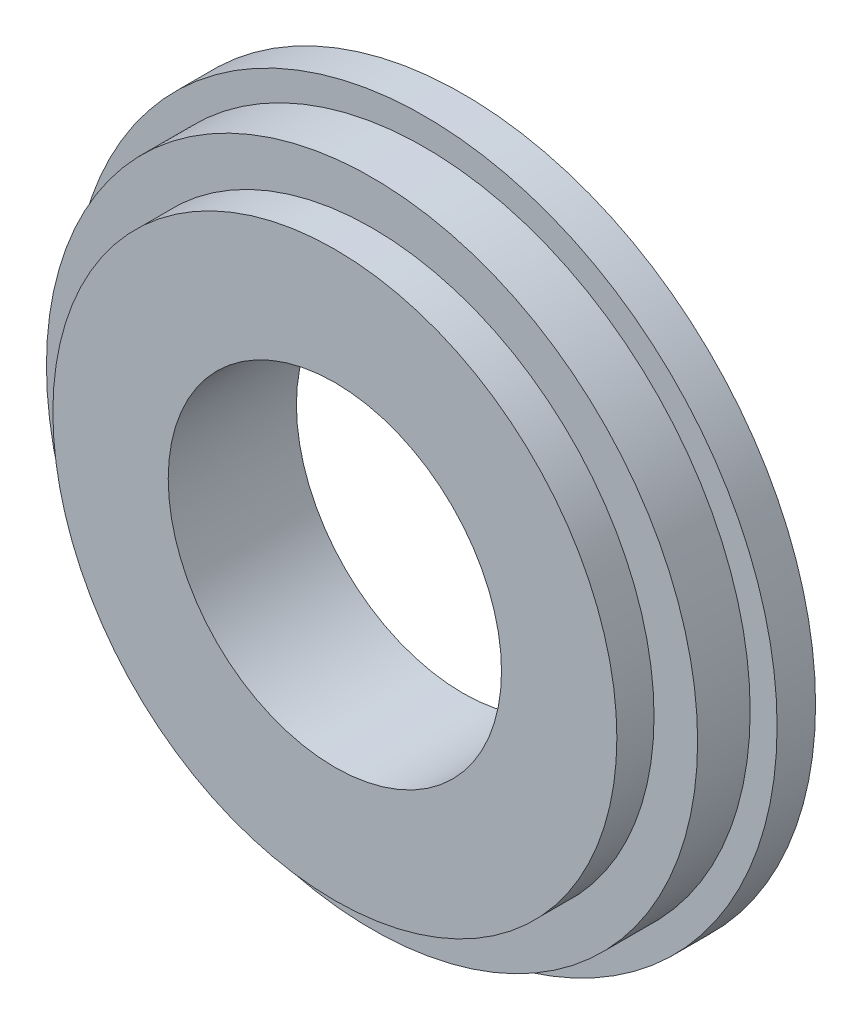
ISO-10303-21;
HEADER;
FILE_DESCRIPTION(('STEP AP214'),'2;1');
FILE_NAME('part.step','',(''),(''),'','','');
FILE_SCHEMA(('AUTOMOTIVE_DESIGN { 1 0 10303 214 1 1 1 1 }'));
ENDSEC;
DATA;
#1=APPLICATION_CONTEXT('core data for automotive mechanical design processes');
#2=APPLICATION_PROTOCOL_DEFINITION('international standard','automotive_design',2000,#1);
#3=PRODUCT_CONTEXT('',#1,'mechanical');
#4=PRODUCT('Part','Part','',(#3));
#5=PRODUCT_RELATED_PRODUCT_CATEGORY('part','',(#4));
#6=PRODUCT_DEFINITION_FORMATION('','',#4);
#7=PRODUCT_DEFINITION_CONTEXT('part definition',#1,'design');
#8=PRODUCT_DEFINITION('design','',#6,#7);
#9=PRODUCT_DEFINITION_SHAPE('','',#8);
#10=(LENGTH_UNIT() NAMED_UNIT(*) SI_UNIT(.MILLI.,.METRE.));
#11=(NAMED_UNIT(*) PLANE_ANGLE_UNIT() SI_UNIT($,.RADIAN.));
#12=(NAMED_UNIT(*) SI_UNIT($,.STERADIAN.) SOLID_ANGLE_UNIT());
#13=UNCERTAINTY_MEASURE_WITH_UNIT(LENGTH_MEASURE(1.E-05),#10,'distance_accuracy_value','');
#14=(GEOMETRIC_REPRESENTATION_CONTEXT(3) GLOBAL_UNCERTAINTY_ASSIGNED_CONTEXT((#13)) GLOBAL_UNIT_ASSIGNED_CONTEXT((#10,
#11,#12)) REPRESENTATION_CONTEXT('',''));
#15=CARTESIAN_POINT('',(0.,0.,0.));
#16=DIRECTION('',(0.,0.,1.));
#17=DIRECTION('',(1.,0.,0.));
#18=AXIS2_PLACEMENT_3D('',#15,#16,#17);
#19=CARTESIAN_POINT('',(0.,0.,3.));
#20=DIRECTION('',(0.,0.,-1.));
#21=DIRECTION('',(-1.,0.,0.));
#22=AXIS2_PLACEMENT_3D('',#19,#20,#21);
#23=CYLINDRICAL_SURFACE('',#22,27.5);
#24=CARTESIAN_POINT('',(0.,0.,3.));
#25=DIRECTION('',(0.,0.,1.));
#26=DIRECTION('',(1.,0.,0.));
#27=AXIS2_PLACEMENT_3D('',#24,#25,#26);
#28=CIRCLE('',#27,27.5);
#29=CARTESIAN_POINT('',(27.5,0.,3.));
#30=VERTEX_POINT('',#29);
#31=EDGE_CURVE('E10',#30,#30,#28,.T.);
#32=ORIENTED_EDGE('',*,*,#31,.F.);
#33=EDGE_LOOP('',(#32));
#34=FACE_BOUND('',#33,.T.);
#35=CARTESIAN_POINT('',(0.,0.,0.));
#36=DIRECTION('',(0.,0.,1.));
#37=DIRECTION('',(1.,0.,0.));
#38=AXIS2_PLACEMENT_3D('',#35,#36,#37);
#39=CIRCLE('',#38,27.5);
#40=CARTESIAN_POINT('',(27.5,0.,0.));
#41=VERTEX_POINT('',#40);
#42=EDGE_CURVE('E40',#41,#41,#39,.T.);
#43=ORIENTED_EDGE('',*,*,#42,.T.);
#44=EDGE_LOOP('',(#43));
#45=FACE_BOUND('',#44,.T.);
#46=ADVANCED_FACE('F33',(#34,#45),#23,.T.);
#47=CARTESIAN_POINT('',(0.,0.,3.));
#48=DIRECTION('',(0.,0.,1.));
#49=DIRECTION('',(1.,0.,0.));
#50=AXIS2_PLACEMENT_3D('',#47,#48,#49);
#51=PLANE('',#50);
#52=CARTESIAN_POINT('',(0.,0.,3.));
#53=DIRECTION('',(0.,0.,1.));
#54=DIRECTION('',(1.,0.,0.));
#55=AXIS2_PLACEMENT_3D('',#52,#53,#54);
#56=CIRCLE('',#55,25.4);
#57=CARTESIAN_POINT('',(25.4,0.,3.));
#58=VERTEX_POINT('',#57);
#59=EDGE_CURVE('E45',#58,#58,#56,.F.);
#60=ORIENTED_EDGE('',*,*,#59,.T.);
#61=EDGE_LOOP('',(#60));
#62=FACE_BOUND('',#61,.T.);
#63=ORIENTED_EDGE('',*,*,#31,.T.);
#64=EDGE_LOOP('',(#63));
#65=FACE_BOUND('',#64,.T.);
#66=ADVANCED_FACE('F84',(#62,#65),#51,.T.);
#67=CARTESIAN_POINT('',(0.,0.,0.));
#68=DIRECTION('',(0.,0.,1.));
#69=DIRECTION('',(1.,0.,0.));
#70=AXIS2_PLACEMENT_3D('',#67,#68,#69);
#71=PLANE('',#70);
#72=CARTESIAN_POINT('',(0.,0.,0.));
#73=DIRECTION('',(0.,0.,1.));
#74=DIRECTION('',(1.,0.,0.));
#75=AXIS2_PLACEMENT_3D('',#72,#73,#74);
#76=CIRCLE('',#75,13.);
#77=CARTESIAN_POINT('',(13.,0.,0.));
#78=VERTEX_POINT('',#77);
#79=EDGE_CURVE('E56',#78,#78,#76,.T.);
#80=ORIENTED_EDGE('',*,*,#79,.T.);
#81=EDGE_LOOP('',(#80));
#82=FACE_BOUND('',#81,.T.);
#83=ORIENTED_EDGE('',*,*,#42,.F.);
#84=EDGE_LOOP('',(#83));
#85=FACE_BOUND('',#84,.T.);
#86=ADVANCED_FACE('F89',(#82,#85),#71,.F.);
#87=CARTESIAN_POINT('',(0.,0.,7.1));
#88=DIRECTION('',(0.,0.,-1.));
#89=DIRECTION('',(-1.,0.,0.));
#90=AXIS2_PLACEMENT_3D('',#87,#88,#89);
#91=CYLINDRICAL_SURFACE('',#90,25.4);
#92=ORIENTED_EDGE('',*,*,#59,.F.);
#93=EDGE_LOOP('',(#92));
#94=FACE_BOUND('',#93,.T.);
#95=CARTESIAN_POINT('',(0.,0.,7.1));
#96=DIRECTION('',(0.,0.,1.));
#97=DIRECTION('',(1.,0.,0.));
#98=AXIS2_PLACEMENT_3D('',#95,#96,#97);
#99=CIRCLE('',#98,25.4);
#100=CARTESIAN_POINT('',(25.4,0.,7.1));
#101=VERTEX_POINT('',#100);
#102=EDGE_CURVE('E49',#101,#101,#99,.T.);
#103=ORIENTED_EDGE('',*,*,#102,.F.);
#104=EDGE_LOOP('',(#103));
#105=FACE_BOUND('',#104,.T.);
#106=ADVANCED_FACE('F79',(#94,#105),#91,.T.);
#107=CARTESIAN_POINT('',(0.,0.,7.1));
#108=DIRECTION('',(0.,0.,1.));
#109=DIRECTION('',(1.,0.,0.));
#110=AXIS2_PLACEMENT_3D('',#107,#108,#109);
#111=PLANE('',#110);
#112=CARTESIAN_POINT('',(0.,0.,7.1));
#113=DIRECTION('',(0.,0.,1.));
#114=DIRECTION('',(1.,0.,0.));
#115=AXIS2_PLACEMENT_3D('',#112,#113,#114);
#116=CIRCLE('',#115,22.);
#117=CARTESIAN_POINT('',(22.,0.,7.1));
#118=VERTEX_POINT('',#117);
#119=EDGE_CURVE('E36',#118,#118,#116,.F.);
#120=ORIENTED_EDGE('',*,*,#119,.T.);
#121=EDGE_LOOP('',(#120));
#122=FACE_BOUND('',#121,.T.);
#123=ORIENTED_EDGE('',*,*,#102,.T.);
#124=EDGE_LOOP('',(#123));
#125=FACE_BOUND('',#124,.T.);
#126=ADVANCED_FACE('F73',(#122,#125),#111,.T.);
#127=CARTESIAN_POINT('',(0.,0.,10.));
#128=DIRECTION('',(0.,0.,-1.));
#129=DIRECTION('',(-1.,0.,0.));
#130=AXIS2_PLACEMENT_3D('',#127,#128,#129);
#131=CYLINDRICAL_SURFACE('',#130,22.);
#132=ORIENTED_EDGE('',*,*,#119,.F.);
#133=EDGE_LOOP('',(#132));
#134=FACE_BOUND('',#133,.T.);
#135=CARTESIAN_POINT('',(0.,0.,10.));
#136=DIRECTION('',(0.,0.,1.));
#137=DIRECTION('',(1.,0.,0.));
#138=AXIS2_PLACEMENT_3D('',#135,#136,#137);
#139=CIRCLE('',#138,22.);
#140=CARTESIAN_POINT('',(22.,0.,10.));
#141=VERTEX_POINT('',#140);
#142=EDGE_CURVE('E52',#141,#141,#139,.T.);
#143=ORIENTED_EDGE('',*,*,#142,.F.);
#144=EDGE_LOOP('',(#143));
#145=FACE_BOUND('',#144,.T.);
#146=ADVANCED_FACE('F68',(#134,#145),#131,.T.);
#147=CARTESIAN_POINT('',(0.,0.,10.));
#148=DIRECTION('',(0.,0.,1.));
#149=DIRECTION('',(1.,0.,0.));
#150=AXIS2_PLACEMENT_3D('',#147,#148,#149);
#151=PLANE('',#150);
#152=CARTESIAN_POINT('',(0.,0.,10.));
#153=DIRECTION('',(0.,0.,1.));
#154=DIRECTION('',(1.,0.,0.));
#155=AXIS2_PLACEMENT_3D('',#152,#153,#154);
#156=CIRCLE('',#155,13.);
#157=CARTESIAN_POINT('',(13.,0.,10.));
#158=VERTEX_POINT('',#157);
#159=EDGE_CURVE('E55',#158,#158,#156,.T.);
#160=ORIENTED_EDGE('',*,*,#159,.F.);
#161=EDGE_LOOP('',(#160));
#162=FACE_BOUND('',#161,.T.);
#163=ORIENTED_EDGE('',*,*,#142,.T.);
#164=EDGE_LOOP('',(#163));
#165=FACE_BOUND('',#164,.T.);
#166=ADVANCED_FACE('F65',(#162,#165),#151,.T.);
#167=CARTESIAN_POINT('',(0.,0.,10.));
#168=DIRECTION('',(0.,0.,-1.));
#169=DIRECTION('',(-1.,0.,0.));
#170=AXIS2_PLACEMENT_3D('',#167,#168,#169);
#171=CYLINDRICAL_SURFACE('',#170,13.);
#172=ORIENTED_EDGE('',*,*,#159,.T.);
#173=EDGE_LOOP('',(#172));
#174=FACE_BOUND('',#173,.T.);
#175=ORIENTED_EDGE('',*,*,#79,.F.);
#176=EDGE_LOOP('',(#175));
#177=FACE_BOUND('',#176,.T.);
#178=ADVANCED_FACE('F62',(#174,#177),#171,.F.);
#179=CLOSED_SHELL('',(#46,#66,#86,#106,#126,#146,#166,#178));
#180=MANIFOLD_SOLID_BREP('B2',#179);
#181=ADVANCED_BREP_SHAPE_REPRESENTATION('',(#18,#180),#14);
#182=SHAPE_DEFINITION_REPRESENTATION(#9,#181);
ENDSEC;
END-ISO-10303-21;
